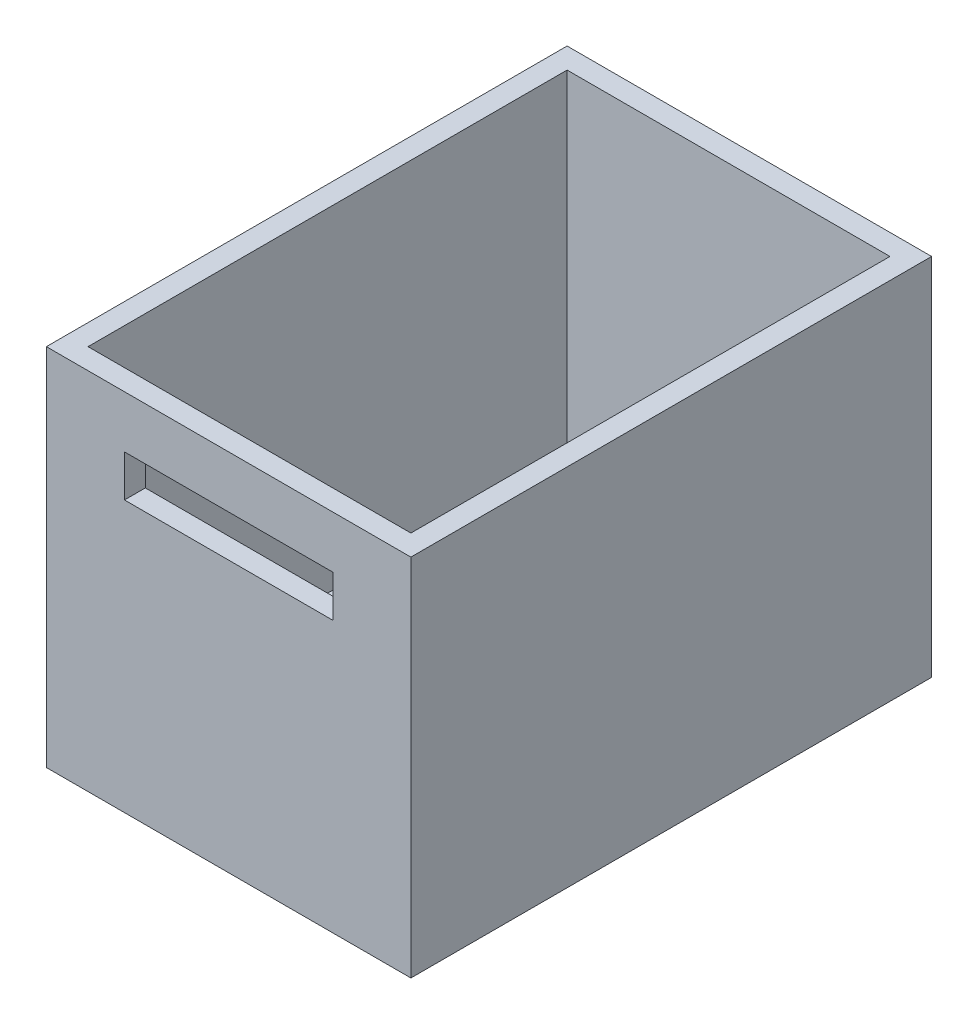
ISO-10303-21;
HEADER;
FILE_DESCRIPTION(('STEP AP214'),'2;1');
FILE_NAME('part.step','',(''),(''),'','','');
FILE_SCHEMA(('AUTOMOTIVE_DESIGN { 1 0 10303 214 1 1 1 1 }'));
ENDSEC;
DATA;
#1=APPLICATION_CONTEXT('core data for automotive mechanical design processes');
#2=APPLICATION_PROTOCOL_DEFINITION('international standard','automotive_design',2000,#1);
#3=PRODUCT_CONTEXT('',#1,'mechanical');
#4=PRODUCT('Part','Part','',(#3));
#5=PRODUCT_RELATED_PRODUCT_CATEGORY('part','',(#4));
#6=PRODUCT_DEFINITION_FORMATION('','',#4);
#7=PRODUCT_DEFINITION_CONTEXT('part definition',#1,'design');
#8=PRODUCT_DEFINITION('design','',#6,#7);
#9=PRODUCT_DEFINITION_SHAPE('','',#8);
#10=(LENGTH_UNIT() NAMED_UNIT(*) SI_UNIT(.MILLI.,.METRE.));
#11=(NAMED_UNIT(*) PLANE_ANGLE_UNIT() SI_UNIT($,.RADIAN.));
#12=(NAMED_UNIT(*) SI_UNIT($,.STERADIAN.) SOLID_ANGLE_UNIT());
#13=UNCERTAINTY_MEASURE_WITH_UNIT(LENGTH_MEASURE(1.E-05),#10,'distance_accuracy_value','');
#14=(GEOMETRIC_REPRESENTATION_CONTEXT(3) GLOBAL_UNCERTAINTY_ASSIGNED_CONTEXT((#13)) GLOBAL_UNIT_ASSIGNED_CONTEXT((#10,
#11,#12)) REPRESENTATION_CONTEXT('',''));
#15=CARTESIAN_POINT('',(0.,0.,0.));
#16=DIRECTION('',(0.,0.,1.));
#17=DIRECTION('',(1.,0.,0.));
#18=AXIS2_PLACEMENT_3D('',#15,#16,#17);
#19=CARTESIAN_POINT('',(87.5,175.,-125.));
#20=DIRECTION('',(-1.,0.,0.));
#21=DIRECTION('',(0.,0.,1.));
#22=AXIS2_PLACEMENT_3D('',#19,#20,#21);
#23=PLANE('',#22);
#24=DIRECTION('',(0.,0.,-1.));
#25=VECTOR('',#24,1.);
#26=CARTESIAN_POINT('',(87.5,0.,-125.));
#27=LINE('',#26,#25);
#28=CARTESIAN_POINT('',(87.5,0.,125.));
#29=VERTEX_POINT('',#28);
#30=CARTESIAN_POINT('',(87.5,0.,-125.));
#31=VERTEX_POINT('',#30);
#32=EDGE_CURVE('E204',#29,#31,#27,.T.);
#33=ORIENTED_EDGE('',*,*,#32,.T.);
#34=DIRECTION('',(0.,-1.,0.));
#35=VECTOR('',#34,1.);
#36=CARTESIAN_POINT('',(87.5,175.,-125.));
#37=LINE('',#36,#35);
#38=CARTESIAN_POINT('',(87.5,175.,-125.));
#39=VERTEX_POINT('',#38);
#40=EDGE_CURVE('E251',#39,#31,#37,.T.);
#41=ORIENTED_EDGE('',*,*,#40,.F.);
#42=DIRECTION('',(0.,0.,-1.));
#43=VECTOR('',#42,1.);
#44=CARTESIAN_POINT('',(87.5,175.,-125.));
#45=LINE('',#44,#43);
#46=CARTESIAN_POINT('',(87.5,175.,125.));
#47=VERTEX_POINT('',#46);
#48=EDGE_CURVE('E214',#47,#39,#45,.T.);
#49=ORIENTED_EDGE('',*,*,#48,.F.);
#50=DIRECTION('',(0.,-1.,0.));
#51=VECTOR('',#50,1.);
#52=CARTESIAN_POINT('',(87.5,175.,125.));
#53=LINE('',#52,#51);
#54=EDGE_CURVE('E228',#47,#29,#53,.T.);
#55=ORIENTED_EDGE('',*,*,#54,.T.);
#56=EDGE_LOOP('',(#33,#41,#49,#55));
#57=FACE_BOUND('',#56,.T.);
#58=ADVANCED_FACE('F45',(#57),#23,.F.);
#59=CARTESIAN_POINT('',(-87.5,175.,-125.));
#60=DIRECTION('',(0.,0.,1.));
#61=DIRECTION('',(1.,0.,0.));
#62=AXIS2_PLACEMENT_3D('',#59,#60,#61);
#63=PLANE('',#62);
#64=DIRECTION('',(-1.,0.,0.));
#65=VECTOR('',#64,1.);
#66=CARTESIAN_POINT('',(-87.5,0.,-125.));
#67=LINE('',#66,#65);
#68=CARTESIAN_POINT('',(-87.5,0.,-125.));
#69=VERTEX_POINT('',#68);
#70=EDGE_CURVE('E232',#31,#69,#67,.T.);
#71=ORIENTED_EDGE('',*,*,#70,.T.);
#72=DIRECTION('',(0.,-1.,0.));
#73=VECTOR('',#72,1.);
#74=CARTESIAN_POINT('',(-87.5,175.,-125.));
#75=LINE('',#74,#73);
#76=CARTESIAN_POINT('',(-87.5,175.,-125.));
#77=VERTEX_POINT('',#76);
#78=EDGE_CURVE('E247',#77,#69,#75,.T.);
#79=ORIENTED_EDGE('',*,*,#78,.F.);
#80=DIRECTION('',(-1.,0.,0.));
#81=VECTOR('',#80,1.);
#82=CARTESIAN_POINT('',(-87.5,175.,-125.));
#83=LINE('',#82,#81);
#84=EDGE_CURVE('E218',#39,#77,#83,.T.);
#85=ORIENTED_EDGE('',*,*,#84,.F.);
#86=ORIENTED_EDGE('',*,*,#40,.T.);
#87=EDGE_LOOP('',(#71,#79,#85,#86));
#88=FACE_BOUND('',#87,.T.);
#89=ADVANCED_FACE('F282',(#88),#63,.F.);
#90=CARTESIAN_POINT('',(-87.5,175.,-125.));
#91=DIRECTION('',(1.,0.,0.));
#92=DIRECTION('',(0.,0.,-1.));
#93=AXIS2_PLACEMENT_3D('',#90,#91,#92);
#94=PLANE('',#93);
#95=DIRECTION('',(0.,0.,1.));
#96=VECTOR('',#95,1.);
#97=CARTESIAN_POINT('',(-87.5,0.,-125.));
#98=LINE('',#97,#96);
#99=CARTESIAN_POINT('',(-87.5,0.,125.));
#100=VERTEX_POINT('',#99);
#101=EDGE_CURVE('E235',#69,#100,#98,.T.);
#102=ORIENTED_EDGE('',*,*,#101,.T.);
#103=DIRECTION('',(0.,-1.,0.));
#104=VECTOR('',#103,1.);
#105=CARTESIAN_POINT('',(-87.5,175.,125.));
#106=LINE('',#105,#104);
#107=CARTESIAN_POINT('',(-87.5,175.,125.));
#108=VERTEX_POINT('',#107);
#109=EDGE_CURVE('E243',#108,#100,#106,.T.);
#110=ORIENTED_EDGE('',*,*,#109,.F.);
#111=DIRECTION('',(0.,0.,1.));
#112=VECTOR('',#111,1.);
#113=CARTESIAN_POINT('',(-87.5,175.,-125.));
#114=LINE('',#113,#112);
#115=EDGE_CURVE('E222',#77,#108,#114,.T.);
#116=ORIENTED_EDGE('',*,*,#115,.F.);
#117=ORIENTED_EDGE('',*,*,#78,.T.);
#118=EDGE_LOOP('',(#102,#110,#116,#117));
#119=FACE_BOUND('',#118,.T.);
#120=ADVANCED_FACE('F287',(#119),#94,.F.);
#121=CARTESIAN_POINT('',(-87.5,175.,125.));
#122=DIRECTION('',(0.,0.,-1.));
#123=DIRECTION('',(-1.,0.,0.));
#124=AXIS2_PLACEMENT_3D('',#121,#122,#123);
#125=PLANE('',#124);
#126=DIRECTION('',(-1.,0.,0.));
#127=VECTOR('',#126,1.);
#128=CARTESIAN_POINT('',(-50.,150.,125.));
#129=LINE('',#128,#127);
#130=CARTESIAN_POINT('',(50.,150.,125.));
#131=VERTEX_POINT('',#130);
#132=CARTESIAN_POINT('',(-50.,150.,125.));
#133=VERTEX_POINT('',#132);
#134=EDGE_CURVE('E147',#131,#133,#129,.T.);
#135=ORIENTED_EDGE('',*,*,#134,.F.);
#136=DIRECTION('',(0.,1.,0.));
#137=VECTOR('',#136,1.);
#138=CARTESIAN_POINT('',(50.,150.,125.));
#139=LINE('',#138,#137);
#140=CARTESIAN_POINT('',(50.,130.,125.));
#141=VERTEX_POINT('',#140);
#142=EDGE_CURVE('E60',#141,#131,#139,.T.);
#143=ORIENTED_EDGE('',*,*,#142,.F.);
#144=DIRECTION('',(1.,0.,0.));
#145=VECTOR('',#144,1.);
#146=CARTESIAN_POINT('',(-50.,130.,125.));
#147=LINE('',#146,#145);
#148=CARTESIAN_POINT('',(-50.,130.,125.));
#149=VERTEX_POINT('',#148);
#150=EDGE_CURVE('E155',#149,#141,#147,.T.);
#151=ORIENTED_EDGE('',*,*,#150,.F.);
#152=DIRECTION('',(0.,-1.,0.));
#153=VECTOR('',#152,1.);
#154=CARTESIAN_POINT('',(-50.,150.,125.));
#155=LINE('',#154,#153);
#156=EDGE_CURVE('E137',#133,#149,#155,.T.);
#157=ORIENTED_EDGE('',*,*,#156,.F.);
#158=EDGE_LOOP('',(#135,#143,#151,#157));
#159=FACE_BOUND('',#158,.T.);
#160=DIRECTION('',(1.,0.,0.));
#161=VECTOR('',#160,1.);
#162=CARTESIAN_POINT('',(-87.5,0.,125.));
#163=LINE('',#162,#161);
#164=EDGE_CURVE('E219',#100,#29,#163,.T.);
#165=ORIENTED_EDGE('',*,*,#164,.T.);
#166=ORIENTED_EDGE('',*,*,#54,.F.);
#167=DIRECTION('',(1.,0.,0.));
#168=VECTOR('',#167,1.);
#169=CARTESIAN_POINT('',(-87.5,175.,125.));
#170=LINE('',#169,#168);
#171=EDGE_CURVE('E225',#108,#47,#170,.T.);
#172=ORIENTED_EDGE('',*,*,#171,.F.);
#173=ORIENTED_EDGE('',*,*,#109,.T.);
#174=EDGE_LOOP('',(#165,#166,#172,#173));
#175=FACE_BOUND('',#174,.T.);
#176=ADVANCED_FACE('F152',(#159,#175),#125,.F.);
#177=CARTESIAN_POINT('',(0.,175.,0.));
#178=DIRECTION('',(0.,1.,0.));
#179=DIRECTION('',(0.,0.,1.));
#180=AXIS2_PLACEMENT_3D('',#177,#178,#179);
#181=PLANE('',#180);
#182=DIRECTION('',(0.,0.,-1.));
#183=VECTOR('',#182,1.);
#184=CARTESIAN_POINT('',(77.5,175.,-115.));
#185=LINE('',#184,#183);
#186=CARTESIAN_POINT('',(77.5,175.,115.));
#187=VERTEX_POINT('',#186);
#188=CARTESIAN_POINT('',(77.5,175.,-115.));
#189=VERTEX_POINT('',#188);
#190=EDGE_CURVE('E165',#187,#189,#185,.T.);
#191=ORIENTED_EDGE('',*,*,#190,.F.);
#192=DIRECTION('',(1.,0.,0.));
#193=VECTOR('',#192,1.);
#194=CARTESIAN_POINT('',(-77.5,175.,115.));
#195=LINE('',#194,#193);
#196=CARTESIAN_POINT('',(-77.5,175.,115.));
#197=VERTEX_POINT('',#196);
#198=EDGE_CURVE('E175',#197,#187,#195,.T.);
#199=ORIENTED_EDGE('',*,*,#198,.F.);
#200=DIRECTION('',(0.,0.,1.));
#201=VECTOR('',#200,1.);
#202=CARTESIAN_POINT('',(-77.5,175.,-115.));
#203=LINE('',#202,#201);
#204=CARTESIAN_POINT('',(-77.5,175.,-115.));
#205=VERTEX_POINT('',#204);
#206=EDGE_CURVE('E194',#205,#197,#203,.T.);
#207=ORIENTED_EDGE('',*,*,#206,.F.);
#208=DIRECTION('',(-1.,0.,0.));
#209=VECTOR('',#208,1.);
#210=CARTESIAN_POINT('',(-77.5,175.,-115.));
#211=LINE('',#210,#209);
#212=EDGE_CURVE('E190',#189,#205,#211,.T.);
#213=ORIENTED_EDGE('',*,*,#212,.F.);
#214=EDGE_LOOP('',(#191,#199,#207,#213));
#215=FACE_BOUND('',#214,.T.);
#216=ORIENTED_EDGE('',*,*,#48,.T.);
#217=ORIENTED_EDGE('',*,*,#84,.T.);
#218=ORIENTED_EDGE('',*,*,#115,.T.);
#219=ORIENTED_EDGE('',*,*,#171,.T.);
#220=EDGE_LOOP('',(#216,#217,#218,#219));
#221=FACE_BOUND('',#220,.T.);
#222=ADVANCED_FACE('F300',(#215,#221),#181,.T.);
#223=CARTESIAN_POINT('',(0.,0.,0.));
#224=DIRECTION('',(0.,1.,0.));
#225=DIRECTION('',(0.,0.,1.));
#226=AXIS2_PLACEMENT_3D('',#223,#224,#225);
#227=PLANE('',#226);
#228=ORIENTED_EDGE('',*,*,#32,.F.);
#229=ORIENTED_EDGE('',*,*,#164,.F.);
#230=ORIENTED_EDGE('',*,*,#101,.F.);
#231=ORIENTED_EDGE('',*,*,#70,.F.);
#232=EDGE_LOOP('',(#228,#229,#230,#231));
#233=FACE_BOUND('',#232,.T.);
#234=ADVANCED_FACE('F295',(#233),#227,.F.);
#235=CARTESIAN_POINT('',(77.5,15.,-115.));
#236=DIRECTION('',(1.,0.,0.));
#237=DIRECTION('',(0.,0.,-1.));
#238=AXIS2_PLACEMENT_3D('',#235,#236,#237);
#239=PLANE('',#238);
#240=ORIENTED_EDGE('',*,*,#190,.T.);
#241=DIRECTION('',(0.,1.,0.));
#242=VECTOR('',#241,1.);
#243=CARTESIAN_POINT('',(77.5,15.,-115.));
#244=LINE('',#243,#242);
#245=CARTESIAN_POINT('',(77.5,15.,-115.));
#246=VERTEX_POINT('',#245);
#247=EDGE_CURVE('E187',#246,#189,#244,.T.);
#248=ORIENTED_EDGE('',*,*,#247,.F.);
#249=DIRECTION('',(0.,0.,-1.));
#250=VECTOR('',#249,1.);
#251=CARTESIAN_POINT('',(77.5,15.,-115.));
#252=LINE('',#251,#250);
#253=CARTESIAN_POINT('',(77.5,15.,115.));
#254=VERTEX_POINT('',#253);
#255=EDGE_CURVE('E170',#254,#246,#252,.T.);
#256=ORIENTED_EDGE('',*,*,#255,.F.);
#257=DIRECTION('',(0.,1.,0.));
#258=VECTOR('',#257,1.);
#259=CARTESIAN_POINT('',(77.5,15.,115.));
#260=LINE('',#259,#258);
#261=EDGE_CURVE('E201',#254,#187,#260,.T.);
#262=ORIENTED_EDGE('',*,*,#261,.T.);
#263=EDGE_LOOP('',(#240,#248,#256,#262));
#264=FACE_BOUND('',#263,.T.);
#265=ADVANCED_FACE('F313',(#264),#239,.F.);
#266=CARTESIAN_POINT('',(-77.5,15.,115.));
#267=DIRECTION('',(0.,0.,1.));
#268=DIRECTION('',(1.,0.,0.));
#269=AXIS2_PLACEMENT_3D('',#266,#267,#268);
#270=PLANE('',#269);
#271=DIRECTION('',(1.,0.,0.));
#272=VECTOR('',#271,1.);
#273=CARTESIAN_POINT('',(-77.5,130.,115.));
#274=LINE('',#273,#272);
#275=CARTESIAN_POINT('',(-50.,130.,115.));
#276=VERTEX_POINT('',#275);
#277=CARTESIAN_POINT('',(50.,130.,115.));
#278=VERTEX_POINT('',#277);
#279=EDGE_CURVE('E53',#276,#278,#274,.T.);
#280=ORIENTED_EDGE('',*,*,#279,.T.);
#281=DIRECTION('',(0.,1.,0.));
#282=VECTOR('',#281,1.);
#283=CARTESIAN_POINT('',(50.,15.,115.));
#284=LINE('',#283,#282);
#285=CARTESIAN_POINT('',(50.,150.,115.));
#286=VERTEX_POINT('',#285);
#287=EDGE_CURVE('E11',#278,#286,#284,.T.);
#288=ORIENTED_EDGE('',*,*,#287,.T.);
#289=DIRECTION('',(-1.,0.,0.));
#290=VECTOR('',#289,1.);
#291=CARTESIAN_POINT('',(-77.5,150.,115.));
#292=LINE('',#291,#290);
#293=CARTESIAN_POINT('',(-50.,150.,115.));
#294=VERTEX_POINT('',#293);
#295=EDGE_CURVE('E255',#286,#294,#292,.T.);
#296=ORIENTED_EDGE('',*,*,#295,.T.);
#297=DIRECTION('',(0.,-1.,0.));
#298=VECTOR('',#297,1.);
#299=CARTESIAN_POINT('',(-50.,15.,115.));
#300=LINE('',#299,#298);
#301=EDGE_CURVE('E140',#294,#276,#300,.T.);
#302=ORIENTED_EDGE('',*,*,#301,.T.);
#303=EDGE_LOOP('',(#280,#288,#296,#302));
#304=FACE_BOUND('',#303,.T.);
#305=ORIENTED_EDGE('',*,*,#198,.T.);
#306=ORIENTED_EDGE('',*,*,#261,.F.);
#307=DIRECTION('',(1.,0.,0.));
#308=VECTOR('',#307,1.);
#309=CARTESIAN_POINT('',(-77.5,15.,115.));
#310=LINE('',#309,#308);
#311=CARTESIAN_POINT('',(-77.5,15.,115.));
#312=VERTEX_POINT('',#311);
#313=EDGE_CURVE('E183',#312,#254,#310,.T.);
#314=ORIENTED_EDGE('',*,*,#313,.F.);
#315=DIRECTION('',(0.,1.,0.));
#316=VECTOR('',#315,1.);
#317=CARTESIAN_POINT('',(-77.5,15.,115.));
#318=LINE('',#317,#316);
#319=EDGE_CURVE('E205',#312,#197,#318,.T.);
#320=ORIENTED_EDGE('',*,*,#319,.T.);
#321=EDGE_LOOP('',(#305,#306,#314,#320));
#322=FACE_BOUND('',#321,.T.);
#323=ADVANCED_FACE('F262',(#304,#322),#270,.F.);
#324=CARTESIAN_POINT('',(-77.5,15.,-115.));
#325=DIRECTION('',(-1.,0.,0.));
#326=DIRECTION('',(0.,0.,1.));
#327=AXIS2_PLACEMENT_3D('',#324,#325,#326);
#328=PLANE('',#327);
#329=ORIENTED_EDGE('',*,*,#206,.T.);
#330=ORIENTED_EDGE('',*,*,#319,.F.);
#331=DIRECTION('',(0.,0.,1.));
#332=VECTOR('',#331,1.);
#333=CARTESIAN_POINT('',(-77.5,15.,-115.));
#334=LINE('',#333,#332);
#335=CARTESIAN_POINT('',(-77.5,15.,-115.));
#336=VERTEX_POINT('',#335);
#337=EDGE_CURVE('E179',#336,#312,#334,.T.);
#338=ORIENTED_EDGE('',*,*,#337,.F.);
#339=DIRECTION('',(0.,1.,0.));
#340=VECTOR('',#339,1.);
#341=CARTESIAN_POINT('',(-77.5,15.,-115.));
#342=LINE('',#341,#340);
#343=EDGE_CURVE('E208',#336,#205,#342,.T.);
#344=ORIENTED_EDGE('',*,*,#343,.T.);
#345=EDGE_LOOP('',(#329,#330,#338,#344));
#346=FACE_BOUND('',#345,.T.);
#347=ADVANCED_FACE('F322',(#346),#328,.F.);
#348=CARTESIAN_POINT('',(-77.5,15.,-115.));
#349=DIRECTION('',(0.,0.,-1.));
#350=DIRECTION('',(-1.,0.,0.));
#351=AXIS2_PLACEMENT_3D('',#348,#349,#350);
#352=PLANE('',#351);
#353=ORIENTED_EDGE('',*,*,#212,.T.);
#354=ORIENTED_EDGE('',*,*,#343,.F.);
#355=DIRECTION('',(-1.,0.,0.));
#356=VECTOR('',#355,1.);
#357=CARTESIAN_POINT('',(-77.5,15.,-115.));
#358=LINE('',#357,#356);
#359=EDGE_CURVE('E174',#246,#336,#358,.T.);
#360=ORIENTED_EDGE('',*,*,#359,.F.);
#361=ORIENTED_EDGE('',*,*,#247,.T.);
#362=EDGE_LOOP('',(#353,#354,#360,#361));
#363=FACE_BOUND('',#362,.T.);
#364=ADVANCED_FACE('F277',(#363),#352,.F.);
#365=CARTESIAN_POINT('',(0.,15.,0.));
#366=DIRECTION('',(0.,1.,0.));
#367=DIRECTION('',(0.,0.,1.));
#368=AXIS2_PLACEMENT_3D('',#365,#366,#367);
#369=PLANE('',#368);
#370=ORIENTED_EDGE('',*,*,#255,.T.);
#371=ORIENTED_EDGE('',*,*,#359,.T.);
#372=ORIENTED_EDGE('',*,*,#337,.T.);
#373=ORIENTED_EDGE('',*,*,#313,.T.);
#374=EDGE_LOOP('',(#370,#371,#372,#373));
#375=FACE_BOUND('',#374,.T.);
#376=ADVANCED_FACE('F269',(#375),#369,.T.);
#377=CARTESIAN_POINT('',(50.,150.,25.));
#378=DIRECTION('',(1.,0.,0.));
#379=DIRECTION('',(0.,0.,-1.));
#380=AXIS2_PLACEMENT_3D('',#377,#378,#379);
#381=PLANE('',#380);
#382=DIRECTION('',(0.,0.,1.));
#383=VECTOR('',#382,1.);
#384=CARTESIAN_POINT('',(50.,130.,25.));
#385=LINE('',#384,#383);
#386=EDGE_CURVE('E162',#278,#141,#385,.T.);
#387=ORIENTED_EDGE('',*,*,#386,.T.);
#388=ORIENTED_EDGE('',*,*,#142,.T.);
#389=DIRECTION('',(0.,0.,1.));
#390=VECTOR('',#389,1.);
#391=CARTESIAN_POINT('',(50.,150.,25.));
#392=LINE('',#391,#390);
#393=EDGE_CURVE('E144',#286,#131,#392,.T.);
#394=ORIENTED_EDGE('',*,*,#393,.F.);
#395=ORIENTED_EDGE('',*,*,#287,.F.);
#396=EDGE_LOOP('',(#387,#388,#394,#395));
#397=FACE_BOUND('',#396,.T.);
#398=ADVANCED_FACE('F267',(#397),#381,.F.);
#399=CARTESIAN_POINT('',(-50.,130.,25.));
#400=DIRECTION('',(0.,-1.,0.));
#401=DIRECTION('',(0.,0.,-1.));
#402=AXIS2_PLACEMENT_3D('',#399,#400,#401);
#403=PLANE('',#402);
#404=DIRECTION('',(0.,0.,1.));
#405=VECTOR('',#404,1.);
#406=CARTESIAN_POINT('',(-50.,130.,25.));
#407=LINE('',#406,#405);
#408=EDGE_CURVE('E143',#276,#149,#407,.T.);
#409=ORIENTED_EDGE('',*,*,#408,.T.);
#410=ORIENTED_EDGE('',*,*,#150,.T.);
#411=ORIENTED_EDGE('',*,*,#386,.F.);
#412=ORIENTED_EDGE('',*,*,#279,.F.);
#413=EDGE_LOOP('',(#409,#410,#411,#412));
#414=FACE_BOUND('',#413,.T.);
#415=ADVANCED_FACE('F266',(#414),#403,.F.);
#416=CARTESIAN_POINT('',(-50.,150.,25.));
#417=DIRECTION('',(-1.,0.,0.));
#418=DIRECTION('',(0.,-1.,0.));
#419=AXIS2_PLACEMENT_3D('',#416,#417,#418);
#420=PLANE('',#419);
#421=DIRECTION('',(0.,0.,1.));
#422=VECTOR('',#421,1.);
#423=CARTESIAN_POINT('',(-50.,150.,25.));
#424=LINE('',#423,#422);
#425=EDGE_CURVE('E68',#294,#133,#424,.T.);
#426=ORIENTED_EDGE('',*,*,#425,.T.);
#427=ORIENTED_EDGE('',*,*,#156,.T.);
#428=ORIENTED_EDGE('',*,*,#408,.F.);
#429=ORIENTED_EDGE('',*,*,#301,.F.);
#430=EDGE_LOOP('',(#426,#427,#428,#429));
#431=FACE_BOUND('',#430,.T.);
#432=ADVANCED_FACE('F134',(#431),#420,.F.);
#433=CARTESIAN_POINT('',(-50.,150.,25.));
#434=DIRECTION('',(0.,1.,0.));
#435=DIRECTION('',(0.,0.,1.));
#436=AXIS2_PLACEMENT_3D('',#433,#434,#435);
#437=PLANE('',#436);
#438=ORIENTED_EDGE('',*,*,#393,.T.);
#439=ORIENTED_EDGE('',*,*,#134,.T.);
#440=ORIENTED_EDGE('',*,*,#425,.F.);
#441=ORIENTED_EDGE('',*,*,#295,.F.);
#442=EDGE_LOOP('',(#438,#439,#440,#441));
#443=FACE_BOUND('',#442,.T.);
#444=ADVANCED_FACE('F148',(#443),#437,.F.);
#445=CLOSED_SHELL('',(#58,#89,#120,#176,#222,#234,#265,#323,#347,#364,#376,#398,#415,#432,#444));
#446=MANIFOLD_SOLID_BREP('B2',#445);
#447=ADVANCED_BREP_SHAPE_REPRESENTATION('',(#18,#446),#14);
#448=SHAPE_DEFINITION_REPRESENTATION(#9,#447);
ENDSEC;
END-ISO-10303-21;
